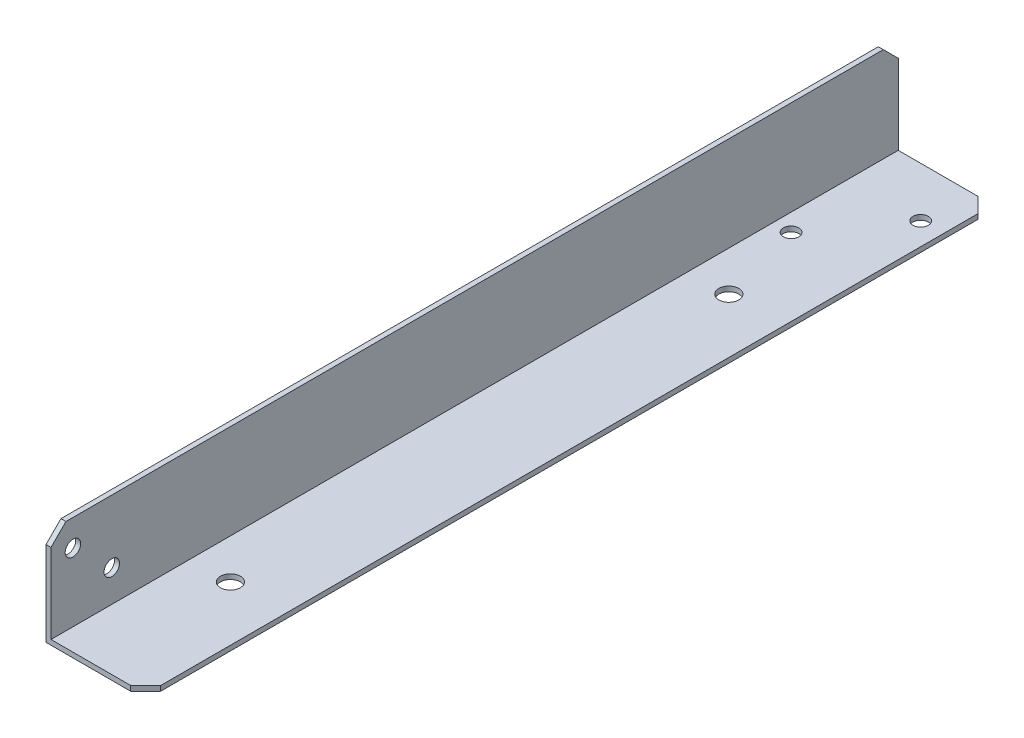
ISO-10303-21;
HEADER;
FILE_DESCRIPTION(('STEP AP214'),'2;1');
FILE_NAME('part.step','',(''),(''),'','','');
FILE_SCHEMA(('AUTOMOTIVE_DESIGN { 1 0 10303 214 1 1 1 1 }'));
ENDSEC;
DATA;
#1=APPLICATION_CONTEXT('core data for automotive mechanical design processes');
#2=APPLICATION_PROTOCOL_DEFINITION('international standard','automotive_design',2000,#1);
#3=PRODUCT_CONTEXT('',#1,'mechanical');
#4=PRODUCT('Part','Part','',(#3));
#5=PRODUCT_RELATED_PRODUCT_CATEGORY('part','',(#4));
#6=PRODUCT_DEFINITION_FORMATION('','',#4);
#7=PRODUCT_DEFINITION_CONTEXT('part definition',#1,'design');
#8=PRODUCT_DEFINITION('design','',#6,#7);
#9=PRODUCT_DEFINITION_SHAPE('','',#8);
#10=(LENGTH_UNIT() NAMED_UNIT(*) SI_UNIT(.MILLI.,.METRE.));
#11=(NAMED_UNIT(*) PLANE_ANGLE_UNIT() SI_UNIT($,.RADIAN.));
#12=(NAMED_UNIT(*) SI_UNIT($,.STERADIAN.) SOLID_ANGLE_UNIT());
#13=UNCERTAINTY_MEASURE_WITH_UNIT(LENGTH_MEASURE(1.E-05),#10,'distance_accuracy_value','');
#14=(GEOMETRIC_REPRESENTATION_CONTEXT(3) GLOBAL_UNCERTAINTY_ASSIGNED_CONTEXT((#13)) GLOBAL_UNIT_ASSIGNED_CONTEXT((#10,
#11,#12)) REPRESENTATION_CONTEXT('',''));
#15=CARTESIAN_POINT('',(0.,0.,0.));
#16=DIRECTION('',(0.,0.,1.));
#17=DIRECTION('',(1.,0.,0.));
#18=AXIS2_PLACEMENT_3D('',#15,#16,#17);
#19=CARTESIAN_POINT('',(0.,20.,170.));
#20=DIRECTION('',(1.,0.,0.));
#21=DIRECTION('',(0.,1.,0.));
#22=AXIS2_PLACEMENT_3D('',#19,#20,#21);
#23=PLANE('',#22);
#24=CARTESIAN_POINT('',(0.,7.38,157.8));
#25=DIRECTION('',(1.,0.,0.));
#26=DIRECTION('',(0.,1.,0.));
#27=AXIS2_PLACEMENT_3D('',#24,#25,#26);
#28=CIRCLE('',#27,1.54999999999999);
#29=CARTESIAN_POINT('',(0.,8.92999999999999,157.8));
#30=VERTEX_POINT('',#29);
#31=EDGE_CURVE('E193',#30,#30,#28,.F.);
#32=ORIENTED_EDGE('',*,*,#31,.F.);
#33=EDGE_LOOP('',(#32));
#34=FACE_BOUND('',#33,.T.);
#35=CARTESIAN_POINT('',(0.,14.68,165.6));
#36=DIRECTION('',(1.,0.,0.));
#37=DIRECTION('',(0.,1.,0.));
#38=AXIS2_PLACEMENT_3D('',#35,#36,#37);
#39=CIRCLE('',#38,1.54999999999999);
#40=CARTESIAN_POINT('',(0.,16.23,165.6));
#41=VERTEX_POINT('',#40);
#42=EDGE_CURVE('E199',#41,#41,#39,.F.);
#43=ORIENTED_EDGE('',*,*,#42,.F.);
#44=EDGE_LOOP('',(#43));
#45=FACE_BOUND('',#44,.T.);
#46=DIRECTION('',(0.,-1.,0.));
#47=VECTOR('',#46,1.);
#48=CARTESIAN_POINT('',(0.,20.,170.));
#49=LINE('',#48,#47);
#50=CARTESIAN_POINT('',(0.,17.,170.));
#51=VERTEX_POINT('',#50);
#52=CARTESIAN_POINT('',(0.,0.,170.));
#53=VERTEX_POINT('',#52);
#54=EDGE_CURVE('E117',#51,#53,#49,.T.);
#55=ORIENTED_EDGE('',*,*,#54,.F.);
#56=DIRECTION('',(0.,0.707106781186546,-0.707106781186549));
#57=VECTOR('',#56,1.);
#58=CARTESIAN_POINT('',(0.,17.,170.));
#59=LINE('',#58,#57);
#60=CARTESIAN_POINT('',(0.,20.,167.));
#61=VERTEX_POINT('',#60);
#62=EDGE_CURVE('E166',#51,#61,#59,.T.);
#63=ORIENTED_EDGE('',*,*,#62,.T.);
#64=DIRECTION('',(0.,0.,-1.));
#65=VECTOR('',#64,1.);
#66=CARTESIAN_POINT('',(0.,20.,170.));
#67=LINE('',#66,#65);
#68=CARTESIAN_POINT('',(0.,20.,3.00000000000003));
#69=VERTEX_POINT('',#68);
#70=EDGE_CURVE('E217',#61,#69,#67,.T.);
#71=ORIENTED_EDGE('',*,*,#70,.T.);
#72=DIRECTION('',(0.,0.707106781186548,0.707106781186548));
#73=VECTOR('',#72,1.);
#74=CARTESIAN_POINT('',(0.,20.,3.00000000000003));
#75=LINE('',#74,#73);
#76=CARTESIAN_POINT('',(0.,17.,0.));
#77=VERTEX_POINT('',#76);
#78=EDGE_CURVE('E164',#69,#77,#75,.F.);
#79=ORIENTED_EDGE('',*,*,#78,.T.);
#80=DIRECTION('',(0.,-1.,0.));
#81=VECTOR('',#80,1.);
#82=CARTESIAN_POINT('',(0.,20.,0.));
#83=LINE('',#82,#81);
#84=CARTESIAN_POINT('',(0.,0.,0.));
#85=VERTEX_POINT('',#84);
#86=EDGE_CURVE('E140',#77,#85,#83,.T.);
#87=ORIENTED_EDGE('',*,*,#86,.T.);
#88=DIRECTION('',(0.,0.,-1.));
#89=VECTOR('',#88,1.);
#90=CARTESIAN_POINT('',(0.,0.,170.));
#91=LINE('',#90,#89);
#92=EDGE_CURVE('E135',#53,#85,#91,.T.);
#93=ORIENTED_EDGE('',*,*,#92,.F.);
#94=EDGE_LOOP('',(#55,#63,#71,#79,#87,#93));
#95=FACE_BOUND('',#94,.T.);
#96=ADVANCED_FACE('F36',(#34,#45,#95),#23,.F.);
#97=CARTESIAN_POINT('',(0.,0.,170.));
#98=DIRECTION('',(0.,1.,0.));
#99=DIRECTION('',(0.,0.,1.));
#100=AXIS2_PLACEMENT_3D('',#97,#98,#99);
#101=PLANE('',#100);
#102=CARTESIAN_POINT('',(9.00000000000004,0.,142.));
#103=DIRECTION('',(0.,-1.,0.));
#104=DIRECTION('',(0.,0.,-1.));
#105=AXIS2_PLACEMENT_3D('',#102,#103,#104);
#106=CIRCLE('',#105,2.);
#107=CARTESIAN_POINT('',(9.00000000000004,0.,140.));
#108=VERTEX_POINT('',#107);
#109=EDGE_CURVE('E178',#108,#108,#106,.T.);
#110=ORIENTED_EDGE('',*,*,#109,.F.);
#111=EDGE_LOOP('',(#110));
#112=FACE_BOUND('',#111,.T.);
#113=CARTESIAN_POINT('',(9.00000000000002,0.,42.));
#114=DIRECTION('',(0.,-1.,0.));
#115=DIRECTION('',(0.,0.,-1.));
#116=AXIS2_PLACEMENT_3D('',#113,#114,#115);
#117=CIRCLE('',#116,2.);
#118=CARTESIAN_POINT('',(9.00000000000002,0.,40.));
#119=VERTEX_POINT('',#118);
#120=EDGE_CURVE('E184',#119,#119,#117,.T.);
#121=ORIENTED_EDGE('',*,*,#120,.F.);
#122=EDGE_LOOP('',(#121));
#123=FACE_BOUND('',#122,.T.);
#124=CARTESIAN_POINT('',(4.5,0.,25.));
#125=DIRECTION('',(0.,1.,0.));
#126=DIRECTION('',(-1.,0.,0.));
#127=AXIS2_PLACEMENT_3D('',#124,#125,#126);
#128=CIRCLE('',#127,1.55);
#129=CARTESIAN_POINT('',(2.95,0.,25.));
#130=VERTEX_POINT('',#129);
#131=EDGE_CURVE('E203',#130,#130,#128,.T.);
#132=ORIENTED_EDGE('',*,*,#131,.T.);
#133=EDGE_LOOP('',(#132));
#134=FACE_BOUND('',#133,.T.);
#135=CARTESIAN_POINT('',(15.5,0.,10.));
#136=DIRECTION('',(0.,1.,0.));
#137=DIRECTION('',(-1.,0.,0.));
#138=AXIS2_PLACEMENT_3D('',#135,#136,#137);
#139=CIRCLE('',#138,1.55);
#140=CARTESIAN_POINT('',(13.95,0.,10.));
#141=VERTEX_POINT('',#140);
#142=EDGE_CURVE('E209',#141,#141,#139,.T.);
#143=ORIENTED_EDGE('',*,*,#142,.T.);
#144=EDGE_LOOP('',(#143));
#145=FACE_BOUND('',#144,.T.);
#146=DIRECTION('',(0.,0.,-1.));
#147=VECTOR('',#146,1.);
#148=CARTESIAN_POINT('',(20.,0.,170.));
#149=LINE('',#148,#147);
#150=CARTESIAN_POINT('',(20.,0.,167.));
#151=VERTEX_POINT('',#150);
#152=CARTESIAN_POINT('',(20.,0.,3.00000000000003));
#153=VERTEX_POINT('',#152);
#154=EDGE_CURVE('E142',#151,#153,#149,.T.);
#155=ORIENTED_EDGE('',*,*,#154,.F.);
#156=DIRECTION('',(-0.707106781186546,0.,0.707106781186549));
#157=VECTOR('',#156,1.);
#158=CARTESIAN_POINT('',(17.,0.,170.));
#159=LINE('',#158,#157);
#160=CARTESIAN_POINT('',(17.,0.,170.));
#161=VERTEX_POINT('',#160);
#162=EDGE_CURVE('E137',#151,#161,#159,.T.);
#163=ORIENTED_EDGE('',*,*,#162,.T.);
#164=DIRECTION('',(1.,0.,0.));
#165=VECTOR('',#164,1.);
#166=CARTESIAN_POINT('',(0.,0.,170.));
#167=LINE('',#166,#165);
#168=EDGE_CURVE('E121',#53,#161,#167,.T.);
#169=ORIENTED_EDGE('',*,*,#168,.F.);
#170=ORIENTED_EDGE('',*,*,#92,.T.);
#171=DIRECTION('',(1.,0.,0.));
#172=VECTOR('',#171,1.);
#173=CARTESIAN_POINT('',(0.,0.,0.));
#174=LINE('',#173,#172);
#175=CARTESIAN_POINT('',(17.,0.,0.));
#176=VERTEX_POINT('',#175);
#177=EDGE_CURVE('E219',#85,#176,#174,.T.);
#178=ORIENTED_EDGE('',*,*,#177,.T.);
#179=DIRECTION('',(-0.707106781186548,0.,-0.707106781186548));
#180=VECTOR('',#179,1.);
#181=CARTESIAN_POINT('',(20.,0.,3.00000000000003));
#182=LINE('',#181,#180);
#183=EDGE_CURVE('E161',#176,#153,#182,.F.);
#184=ORIENTED_EDGE('',*,*,#183,.T.);
#185=EDGE_LOOP('',(#155,#163,#169,#170,#178,#184));
#186=FACE_BOUND('',#185,.T.);
#187=ADVANCED_FACE('F133',(#112,#123,#134,#145,#186),#101,.F.);
#188=CARTESIAN_POINT('',(20.,0.,170.));
#189=DIRECTION('',(-1.,0.,0.));
#190=DIRECTION('',(0.,0.,1.));
#191=AXIS2_PLACEMENT_3D('',#188,#189,#190);
#192=PLANE('',#191);
#193=DIRECTION('',(0.,0.,-1.));
#194=VECTOR('',#193,1.);
#195=CARTESIAN_POINT('',(20.,1.,170.));
#196=LINE('',#195,#194);
#197=CARTESIAN_POINT('',(20.,1.,167.));
#198=VERTEX_POINT('',#197);
#199=CARTESIAN_POINT('',(20.,1.,3.00000000000003));
#200=VERTEX_POINT('',#199);
#201=EDGE_CURVE('E147',#198,#200,#196,.T.);
#202=ORIENTED_EDGE('',*,*,#201,.F.);
#203=DIRECTION('',(0.,-1.,0.));
#204=VECTOR('',#203,1.);
#205=CARTESIAN_POINT('',(20.,0.,167.));
#206=LINE('',#205,#204);
#207=EDGE_CURVE('E159',#198,#151,#206,.T.);
#208=ORIENTED_EDGE('',*,*,#207,.T.);
#209=ORIENTED_EDGE('',*,*,#154,.T.);
#210=DIRECTION('',(0.,1.,0.));
#211=VECTOR('',#210,1.);
#212=CARTESIAN_POINT('',(20.,0.,3.00000000000003));
#213=LINE('',#212,#211);
#214=EDGE_CURVE('E156',#153,#200,#213,.T.);
#215=ORIENTED_EDGE('',*,*,#214,.T.);
#216=EDGE_LOOP('',(#202,#208,#209,#215));
#217=FACE_BOUND('',#216,.T.);
#218=ADVANCED_FACE('F238',(#217),#192,.F.);
#219=CARTESIAN_POINT('',(20.,1.,170.));
#220=DIRECTION('',(0.,-1.,0.));
#221=DIRECTION('',(1.,0.,0.));
#222=AXIS2_PLACEMENT_3D('',#219,#220,#221);
#223=PLANE('',#222);
#224=CARTESIAN_POINT('',(9.00000000000004,1.,142.));
#225=DIRECTION('',(0.,-1.,0.));
#226=DIRECTION('',(1.,0.,0.));
#227=AXIS2_PLACEMENT_3D('',#224,#225,#226);
#228=CIRCLE('',#227,2.);
#229=CARTESIAN_POINT('',(11.,1.,142.));
#230=VERTEX_POINT('',#229);
#231=EDGE_CURVE('E40',#230,#230,#228,.T.);
#232=ORIENTED_EDGE('',*,*,#231,.T.);
#233=EDGE_LOOP('',(#232));
#234=FACE_BOUND('',#233,.T.);
#235=CARTESIAN_POINT('',(9.00000000000002,1.,42.));
#236=DIRECTION('',(0.,-1.,0.));
#237=DIRECTION('',(1.,0.,0.));
#238=AXIS2_PLACEMENT_3D('',#235,#236,#237);
#239=CIRCLE('',#238,2.);
#240=CARTESIAN_POINT('',(11.,1.,42.));
#241=VERTEX_POINT('',#240);
#242=EDGE_CURVE('E176',#241,#241,#239,.T.);
#243=ORIENTED_EDGE('',*,*,#242,.T.);
#244=EDGE_LOOP('',(#243));
#245=FACE_BOUND('',#244,.T.);
#246=CARTESIAN_POINT('',(4.50000000000001,1.,25.));
#247=DIRECTION('',(0.,1.,0.));
#248=DIRECTION('',(-1.,0.,0.));
#249=AXIS2_PLACEMENT_3D('',#246,#247,#248);
#250=CIRCLE('',#249,1.55);
#251=CARTESIAN_POINT('',(2.95000000000001,1.,25.));
#252=VERTEX_POINT('',#251);
#253=EDGE_CURVE('E202',#252,#252,#250,.T.);
#254=ORIENTED_EDGE('',*,*,#253,.F.);
#255=EDGE_LOOP('',(#254));
#256=FACE_BOUND('',#255,.T.);
#257=CARTESIAN_POINT('',(15.5,1.,10.));
#258=DIRECTION('',(0.,1.,0.));
#259=DIRECTION('',(-1.,0.,0.));
#260=AXIS2_PLACEMENT_3D('',#257,#258,#259);
#261=CIRCLE('',#260,1.55);
#262=CARTESIAN_POINT('',(13.95,1.,10.));
#263=VERTEX_POINT('',#262);
#264=EDGE_CURVE('E206',#263,#263,#261,.T.);
#265=ORIENTED_EDGE('',*,*,#264,.F.);
#266=EDGE_LOOP('',(#265));
#267=FACE_BOUND('',#266,.T.);
#268=DIRECTION('',(-1.,0.,0.));
#269=VECTOR('',#268,1.);
#270=CARTESIAN_POINT('',(20.,1.,170.));
#271=LINE('',#270,#269);
#272=CARTESIAN_POINT('',(17.,1.,170.));
#273=VERTEX_POINT('',#272);
#274=CARTESIAN_POINT('',(1.00000000000004,1.,170.));
#275=VERTEX_POINT('',#274);
#276=EDGE_CURVE('E138',#273,#275,#271,.T.);
#277=ORIENTED_EDGE('',*,*,#276,.F.);
#278=DIRECTION('',(0.707106781186546,0.,-0.707106781186549));
#279=VECTOR('',#278,1.);
#280=CARTESIAN_POINT('',(17.,1.,170.));
#281=LINE('',#280,#279);
#282=EDGE_CURVE('E154',#273,#198,#281,.T.);
#283=ORIENTED_EDGE('',*,*,#282,.T.);
#284=ORIENTED_EDGE('',*,*,#201,.T.);
#285=DIRECTION('',(0.707106781186548,0.,0.707106781186548));
#286=VECTOR('',#285,1.);
#287=CARTESIAN_POINT('',(20.,1.,3.00000000000003));
#288=LINE('',#287,#286);
#289=CARTESIAN_POINT('',(17.,1.,0.));
#290=VERTEX_POINT('',#289);
#291=EDGE_CURVE('E152',#200,#290,#288,.F.);
#292=ORIENTED_EDGE('',*,*,#291,.T.);
#293=DIRECTION('',(-1.,0.,0.));
#294=VECTOR('',#293,1.);
#295=CARTESIAN_POINT('',(20.,1.,0.));
#296=LINE('',#295,#294);
#297=CARTESIAN_POINT('',(1.,1.,0.));
#298=VERTEX_POINT('',#297);
#299=EDGE_CURVE('E221',#290,#298,#296,.T.);
#300=ORIENTED_EDGE('',*,*,#299,.T.);
#301=DIRECTION('',(0.,0.,-1.));
#302=VECTOR('',#301,1.);
#303=CARTESIAN_POINT('',(1.00000000000004,1.,170.));
#304=LINE('',#303,#302);
#305=EDGE_CURVE('E228',#275,#298,#304,.T.);
#306=ORIENTED_EDGE('',*,*,#305,.F.);
#307=EDGE_LOOP('',(#277,#283,#284,#292,#300,#306));
#308=FACE_BOUND('',#307,.T.);
#309=ADVANCED_FACE('F234',(#234,#245,#256,#267,#308),#223,.F.);
#310=CARTESIAN_POINT('',(1.00000000000004,1.,170.));
#311=DIRECTION('',(-1.,0.,0.));
#312=DIRECTION('',(0.,-1.,0.));
#313=AXIS2_PLACEMENT_3D('',#310,#311,#312);
#314=PLANE('',#313);
#315=CARTESIAN_POINT('',(1.,7.38,157.8));
#316=DIRECTION('',(1.,0.,0.));
#317=DIRECTION('',(0.,1.,0.));
#318=AXIS2_PLACEMENT_3D('',#315,#316,#317);
#319=CIRCLE('',#318,1.54999999999999);
#320=CARTESIAN_POINT('',(1.,8.92999999999999,157.8));
#321=VERTEX_POINT('',#320);
#322=EDGE_CURVE('E182',#321,#321,#319,.T.);
#323=ORIENTED_EDGE('',*,*,#322,.F.);
#324=EDGE_LOOP('',(#323));
#325=FACE_BOUND('',#324,.T.);
#326=CARTESIAN_POINT('',(1.,14.68,165.6));
#327=DIRECTION('',(1.,0.,0.));
#328=DIRECTION('',(0.,1.,0.));
#329=AXIS2_PLACEMENT_3D('',#326,#327,#328);
#330=CIRCLE('',#329,1.54999999999999);
#331=CARTESIAN_POINT('',(1.,16.23,165.6));
#332=VERTEX_POINT('',#331);
#333=EDGE_CURVE('E196',#332,#332,#330,.T.);
#334=ORIENTED_EDGE('',*,*,#333,.F.);
#335=EDGE_LOOP('',(#334));
#336=FACE_BOUND('',#335,.T.);
#337=DIRECTION('',(0.,0.,-1.));
#338=VECTOR('',#337,1.);
#339=CARTESIAN_POINT('',(1.00000000000004,20.,170.));
#340=LINE('',#339,#338);
#341=CARTESIAN_POINT('',(1.,20.,167.));
#342=VERTEX_POINT('',#341);
#343=CARTESIAN_POINT('',(1.00000000000004,20.,3.00000000000004));
#344=VERTEX_POINT('',#343);
#345=EDGE_CURVE('E226',#342,#344,#340,.T.);
#346=ORIENTED_EDGE('',*,*,#345,.F.);
#347=DIRECTION('',(0.,-0.707106781186546,0.707106781186549));
#348=VECTOR('',#347,1.);
#349=CARTESIAN_POINT('',(1.00000000000004,17.,170.));
#350=LINE('',#349,#348);
#351=CARTESIAN_POINT('',(1.00000000000004,17.,170.));
#352=VERTEX_POINT('',#351);
#353=EDGE_CURVE('E174',#342,#352,#350,.T.);
#354=ORIENTED_EDGE('',*,*,#353,.T.);
#355=DIRECTION('',(0.,1.,0.));
#356=VECTOR('',#355,1.);
#357=CARTESIAN_POINT('',(1.00000000000004,1.,170.));
#358=LINE('',#357,#356);
#359=EDGE_CURVE('E215',#275,#352,#358,.T.);
#360=ORIENTED_EDGE('',*,*,#359,.F.);
#361=ORIENTED_EDGE('',*,*,#305,.T.);
#362=DIRECTION('',(0.,1.,0.));
#363=VECTOR('',#362,1.);
#364=CARTESIAN_POINT('',(1.,1.,0.));
#365=LINE('',#364,#363);
#366=CARTESIAN_POINT('',(1.,17.,0.));
#367=VERTEX_POINT('',#366);
#368=EDGE_CURVE('E128',#298,#367,#365,.T.);
#369=ORIENTED_EDGE('',*,*,#368,.T.);
#370=DIRECTION('',(0.,-0.707106781186548,-0.707106781186548));
#371=VECTOR('',#370,1.);
#372=CARTESIAN_POINT('',(1.00000000000004,20.,3.00000000000004));
#373=LINE('',#372,#371);
#374=EDGE_CURVE('E58',#367,#344,#373,.F.);
#375=ORIENTED_EDGE('',*,*,#374,.T.);
#376=EDGE_LOOP('',(#346,#354,#360,#361,#369,#375));
#377=FACE_BOUND('',#376,.T.);
#378=ADVANCED_FACE('F244',(#325,#336,#377),#314,.F.);
#379=CARTESIAN_POINT('',(1.00000000000004,20.,170.));
#380=DIRECTION('',(0.,-1.,0.));
#381=DIRECTION('',(0.,0.,-1.));
#382=AXIS2_PLACEMENT_3D('',#379,#380,#381);
#383=PLANE('',#382);
#384=ORIENTED_EDGE('',*,*,#70,.F.);
#385=DIRECTION('',(1.,0.,0.));
#386=VECTOR('',#385,1.);
#387=CARTESIAN_POINT('',(1.,20.,167.));
#388=LINE('',#387,#386);
#389=EDGE_CURVE('E171',#61,#342,#388,.T.);
#390=ORIENTED_EDGE('',*,*,#389,.T.);
#391=ORIENTED_EDGE('',*,*,#345,.T.);
#392=DIRECTION('',(-1.,0.,0.));
#393=VECTOR('',#392,1.);
#394=CARTESIAN_POINT('',(1.00000000000004,20.,3.00000000000004));
#395=LINE('',#394,#393);
#396=EDGE_CURVE('E168',#344,#69,#395,.T.);
#397=ORIENTED_EDGE('',*,*,#396,.T.);
#398=EDGE_LOOP('',(#384,#390,#391,#397));
#399=FACE_BOUND('',#398,.T.);
#400=ADVANCED_FACE('F251',(#399),#383,.F.);
#401=CARTESIAN_POINT('',(0.,0.,170.));
#402=DIRECTION('',(0.,0.,1.));
#403=DIRECTION('',(1.,0.,0.));
#404=AXIS2_PLACEMENT_3D('',#401,#402,#403);
#405=PLANE('',#404);
#406=ORIENTED_EDGE('',*,*,#168,.T.);
#407=DIRECTION('',(0.,1.,0.));
#408=VECTOR('',#407,1.);
#409=CARTESIAN_POINT('',(17.,1.,170.));
#410=LINE('',#409,#408);
#411=EDGE_CURVE('E144',#161,#273,#410,.T.);
#412=ORIENTED_EDGE('',*,*,#411,.T.);
#413=ORIENTED_EDGE('',*,*,#276,.T.);
#414=ORIENTED_EDGE('',*,*,#359,.T.);
#415=DIRECTION('',(-1.,0.,0.));
#416=VECTOR('',#415,1.);
#417=CARTESIAN_POINT('',(0.,17.,170.));
#418=LINE('',#417,#416);
#419=EDGE_CURVE('E125',#352,#51,#418,.T.);
#420=ORIENTED_EDGE('',*,*,#419,.T.);
#421=ORIENTED_EDGE('',*,*,#54,.T.);
#422=EDGE_LOOP('',(#406,#412,#413,#414,#420,#421));
#423=FACE_BOUND('',#422,.T.);
#424=ADVANCED_FACE('F119',(#423),#405,.T.);
#425=CARTESIAN_POINT('',(0.,0.,0.));
#426=DIRECTION('',(0.,0.,1.));
#427=DIRECTION('',(1.,0.,0.));
#428=AXIS2_PLACEMENT_3D('',#425,#426,#427);
#429=PLANE('',#428);
#430=ORIENTED_EDGE('',*,*,#86,.F.);
#431=DIRECTION('',(1.,0.,0.));
#432=VECTOR('',#431,1.);
#433=CARTESIAN_POINT('',(0.,17.,0.));
#434=LINE('',#433,#432);
#435=EDGE_CURVE('E11',#77,#367,#434,.T.);
#436=ORIENTED_EDGE('',*,*,#435,.T.);
#437=ORIENTED_EDGE('',*,*,#368,.F.);
#438=ORIENTED_EDGE('',*,*,#299,.F.);
#439=DIRECTION('',(0.,-1.,0.));
#440=VECTOR('',#439,1.);
#441=CARTESIAN_POINT('',(17.,0.,0.));
#442=LINE('',#441,#440);
#443=EDGE_CURVE('E45',#290,#176,#442,.T.);
#444=ORIENTED_EDGE('',*,*,#443,.T.);
#445=ORIENTED_EDGE('',*,*,#177,.F.);
#446=EDGE_LOOP('',(#430,#436,#437,#438,#444,#445));
#447=FACE_BOUND('',#446,.T.);
#448=ADVANCED_FACE('F255',(#447),#429,.F.);
#449=CARTESIAN_POINT('',(17.,0.,170.));
#450=DIRECTION('',(0.707106781186549,0.,0.707106781186546));
#451=DIRECTION('',(0.,-1.,0.));
#452=AXIS2_PLACEMENT_3D('',#449,#450,#451);
#453=PLANE('',#452);
#454=ORIENTED_EDGE('',*,*,#162,.F.);
#455=ORIENTED_EDGE('',*,*,#207,.F.);
#456=ORIENTED_EDGE('',*,*,#282,.F.);
#457=ORIENTED_EDGE('',*,*,#411,.F.);
#458=EDGE_LOOP('',(#454,#455,#456,#457));
#459=FACE_BOUND('',#458,.T.);
#460=ADVANCED_FACE('F241',(#459),#453,.T.);
#461=CARTESIAN_POINT('',(0.,17.,170.));
#462=DIRECTION('',(0.,0.707106781186549,0.707106781186546));
#463=DIRECTION('',(1.,0.,0.));
#464=AXIS2_PLACEMENT_3D('',#461,#462,#463);
#465=PLANE('',#464);
#466=ORIENTED_EDGE('',*,*,#353,.F.);
#467=ORIENTED_EDGE('',*,*,#389,.F.);
#468=ORIENTED_EDGE('',*,*,#62,.F.);
#469=ORIENTED_EDGE('',*,*,#419,.F.);
#470=EDGE_LOOP('',(#466,#467,#468,#469));
#471=FACE_BOUND('',#470,.T.);
#472=ADVANCED_FACE('F247',(#471),#465,.T.);
#473=CARTESIAN_POINT('',(1.00000000000004,20.,3.00000000000004));
#474=DIRECTION('',(0.,-0.707106781186547,0.707106781186547));
#475=DIRECTION('',(-1.,0.,0.));
#476=AXIS2_PLACEMENT_3D('',#473,#474,#475);
#477=PLANE('',#476);
#478=ORIENTED_EDGE('',*,*,#374,.F.);
#479=ORIENTED_EDGE('',*,*,#435,.F.);
#480=ORIENTED_EDGE('',*,*,#78,.F.);
#481=ORIENTED_EDGE('',*,*,#396,.F.);
#482=EDGE_LOOP('',(#478,#479,#480,#481));
#483=FACE_BOUND('',#482,.T.);
#484=ADVANCED_FACE('F254',(#483),#477,.F.);
#485=CARTESIAN_POINT('',(20.,0.,3.00000000000003));
#486=DIRECTION('',(-0.707106781186547,0.,0.707106781186547));
#487=DIRECTION('',(0.,1.,0.));
#488=AXIS2_PLACEMENT_3D('',#485,#486,#487);
#489=PLANE('',#488);
#490=ORIENTED_EDGE('',*,*,#183,.F.);
#491=ORIENTED_EDGE('',*,*,#443,.F.);
#492=ORIENTED_EDGE('',*,*,#291,.F.);
#493=ORIENTED_EDGE('',*,*,#214,.F.);
#494=EDGE_LOOP('',(#490,#491,#492,#493));
#495=FACE_BOUND('',#494,.T.);
#496=ADVANCED_FACE('F38',(#495),#489,.F.);
#497=CARTESIAN_POINT('',(15.5,0.,10.));
#498=DIRECTION('',(0.,1.,0.));
#499=DIRECTION('',(-1.,0.,0.));
#500=AXIS2_PLACEMENT_3D('',#497,#498,#499);
#501=CYLINDRICAL_SURFACE('',#500,1.55);
#502=ORIENTED_EDGE('',*,*,#142,.F.);
#503=EDGE_LOOP('',(#502));
#504=FACE_BOUND('',#503,.T.);
#505=ORIENTED_EDGE('',*,*,#264,.T.);
#506=EDGE_LOOP('',(#505));
#507=FACE_BOUND('',#506,.T.);
#508=ADVANCED_FACE('F260',(#504,#507),#501,.F.);
#509=CARTESIAN_POINT('',(4.5,0.,25.));
#510=DIRECTION('',(0.,1.,0.));
#511=DIRECTION('',(-1.,0.,0.));
#512=AXIS2_PLACEMENT_3D('',#509,#510,#511);
#513=CYLINDRICAL_SURFACE('',#512,1.55);
#514=ORIENTED_EDGE('',*,*,#131,.F.);
#515=EDGE_LOOP('',(#514));
#516=FACE_BOUND('',#515,.T.);
#517=ORIENTED_EDGE('',*,*,#253,.T.);
#518=EDGE_LOOP('',(#517));
#519=FACE_BOUND('',#518,.T.);
#520=ADVANCED_FACE('F265',(#516,#519),#513,.F.);
#521=CARTESIAN_POINT('',(-4.38406204335658,14.68,165.6));
#522=DIRECTION('',(1.,0.,0.));
#523=DIRECTION('',(0.,1.,0.));
#524=AXIS2_PLACEMENT_3D('',#521,#522,#523);
#525=CYLINDRICAL_SURFACE('',#524,1.54999999999999);
#526=ORIENTED_EDGE('',*,*,#42,.T.);
#527=EDGE_LOOP('',(#526));
#528=FACE_BOUND('',#527,.T.);
#529=ORIENTED_EDGE('',*,*,#333,.T.);
#530=EDGE_LOOP('',(#529));
#531=FACE_BOUND('',#530,.T.);
#532=ADVANCED_FACE('F305',(#528,#531),#525,.F.);
#533=CARTESIAN_POINT('',(-4.38406204335658,7.38,157.8));
#534=DIRECTION('',(1.,0.,0.));
#535=DIRECTION('',(0.,1.,0.));
#536=AXIS2_PLACEMENT_3D('',#533,#534,#535);
#537=CYLINDRICAL_SURFACE('',#536,1.54999999999999);
#538=ORIENTED_EDGE('',*,*,#31,.T.);
#539=EDGE_LOOP('',(#538));
#540=FACE_BOUND('',#539,.T.);
#541=ORIENTED_EDGE('',*,*,#322,.T.);
#542=EDGE_LOOP('',(#541));
#543=FACE_BOUND('',#542,.T.);
#544=ADVANCED_FACE('F313',(#540,#543),#537,.F.);
#545=CARTESIAN_POINT('',(9.00000000000002,20.,42.));
#546=DIRECTION('',(0.,-1.,0.));
#547=DIRECTION('',(0.,0.,-1.));
#548=AXIS2_PLACEMENT_3D('',#545,#546,#547);
#549=CYLINDRICAL_SURFACE('',#548,2.);
#550=ORIENTED_EDGE('',*,*,#120,.T.);
#551=EDGE_LOOP('',(#550));
#552=FACE_BOUND('',#551,.T.);
#553=ORIENTED_EDGE('',*,*,#242,.F.);
#554=EDGE_LOOP('',(#553));
#555=FACE_BOUND('',#554,.T.);
#556=ADVANCED_FACE('F321',(#552,#555),#549,.F.);
#557=CARTESIAN_POINT('',(9.00000000000004,20.,142.));
#558=DIRECTION('',(0.,-1.,0.));
#559=DIRECTION('',(0.,0.,-1.));
#560=AXIS2_PLACEMENT_3D('',#557,#558,#559);
#561=CYLINDRICAL_SURFACE('',#560,2.);
#562=ORIENTED_EDGE('',*,*,#109,.T.);
#563=EDGE_LOOP('',(#562));
#564=FACE_BOUND('',#563,.T.);
#565=ORIENTED_EDGE('',*,*,#231,.F.);
#566=EDGE_LOOP('',(#565));
#567=FACE_BOUND('',#566,.T.);
#568=ADVANCED_FACE('F329',(#564,#567),#561,.F.);
#569=CLOSED_SHELL('',(#96,#187,#218,#309,#378,#400,#424,#448,#460,#472,#484,#496,#508,#520,#532,
#544,#556,#568));
#570=MANIFOLD_SOLID_BREP('B2',#569);
#571=ADVANCED_BREP_SHAPE_REPRESENTATION('',(#18,#570),#14);
#572=SHAPE_DEFINITION_REPRESENTATION(#9,#571);
ENDSEC;
END-ISO-10303-21;
